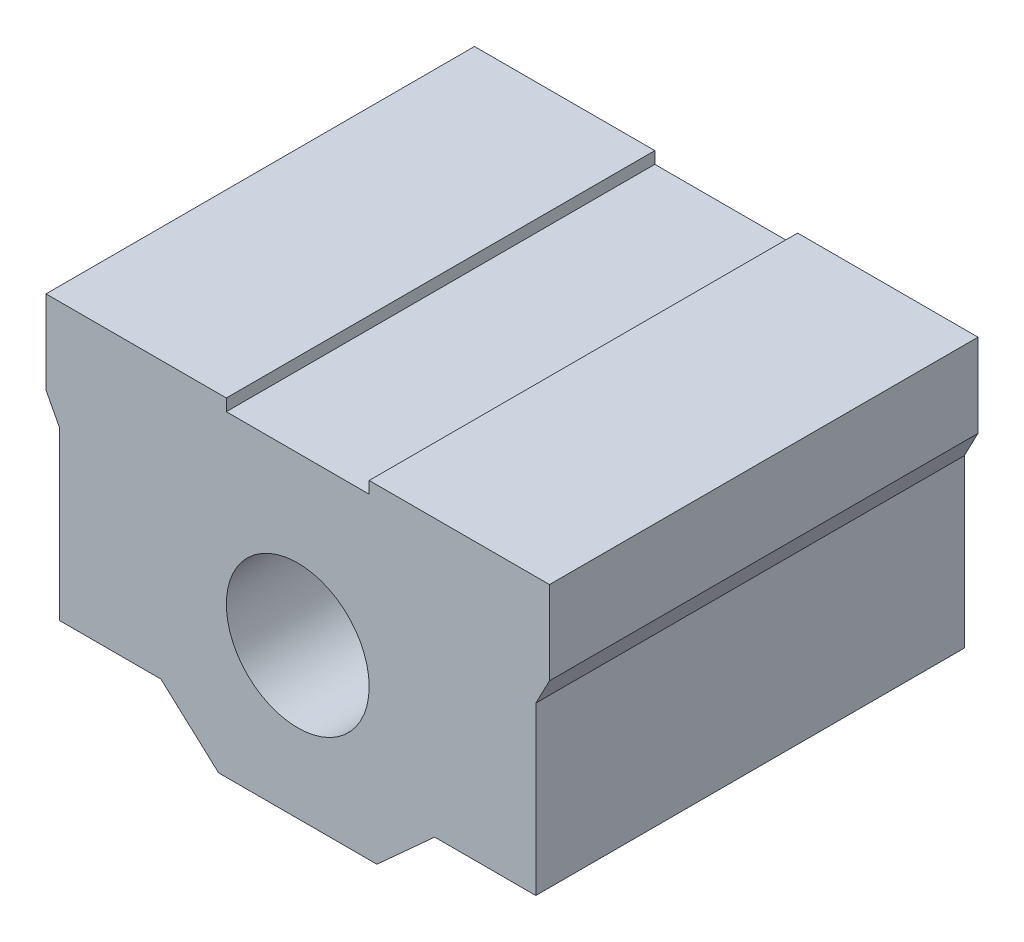
ISO-10303-21;
HEADER;
FILE_DESCRIPTION(('STEP AP214'),'2;1');
FILE_NAME('part.step','',(''),(''),'','','');
FILE_SCHEMA(('AUTOMOTIVE_DESIGN { 1 0 10303 214 1 1 1 1 }'));
ENDSEC;
DATA;
#1=APPLICATION_CONTEXT('core data for automotive mechanical design processes');
#2=APPLICATION_PROTOCOL_DEFINITION('international standard','automotive_design',2000,#1);
#3=PRODUCT_CONTEXT('',#1,'mechanical');
#4=PRODUCT('Part','Part','',(#3));
#5=PRODUCT_RELATED_PRODUCT_CATEGORY('part','',(#4));
#6=PRODUCT_DEFINITION_FORMATION('','',#4);
#7=PRODUCT_DEFINITION_CONTEXT('part definition',#1,'design');
#8=PRODUCT_DEFINITION('design','',#6,#7);
#9=PRODUCT_DEFINITION_SHAPE('','',#8);
#10=(LENGTH_UNIT() NAMED_UNIT(*) SI_UNIT(.MILLI.,.METRE.));
#11=(NAMED_UNIT(*) PLANE_ANGLE_UNIT() SI_UNIT($,.RADIAN.));
#12=(NAMED_UNIT(*) SI_UNIT($,.STERADIAN.) SOLID_ANGLE_UNIT());
#13=UNCERTAINTY_MEASURE_WITH_UNIT(LENGTH_MEASURE(1.E-05),#10,'distance_accuracy_value','');
#14=(GEOMETRIC_REPRESENTATION_CONTEXT(3) GLOBAL_UNCERTAINTY_ASSIGNED_CONTEXT((#13)) GLOBAL_UNIT_ASSIGNED_CONTEXT((#10,
#11,#12)) REPRESENTATION_CONTEXT('',''));
#15=CARTESIAN_POINT('',(0.,0.,0.));
#16=DIRECTION('',(0.,0.,1.));
#17=DIRECTION('',(1.,0.,0.));
#18=AXIS2_PLACEMENT_3D('',#15,#16,#17);
#19=CARTESIAN_POINT('',(0.,0.,36.));
#20=DIRECTION('',(0.,0.,-1.));
#21=DIRECTION('',(-1.,0.,0.));
#22=AXIS2_PLACEMENT_3D('',#19,#20,#21);
#23=PLANE('',#22);
#24=DIRECTION('',(0.740630666511788,-0.671912357247808,0.));
#25=VECTOR('',#24,1.);
#26=CARTESIAN_POINT('',(-6.65,0.,36.));
#27=LINE('',#26,#25);
#28=CARTESIAN_POINT('',(-11.5,4.4,36.));
#29=VERTEX_POINT('',#28);
#30=CARTESIAN_POINT('',(-6.65,0.,36.));
#31=VERTEX_POINT('',#30);
#32=EDGE_CURVE('E236',#29,#31,#27,.T.);
#33=ORIENTED_EDGE('',*,*,#32,.T.);
#34=DIRECTION('',(1.,0.,0.));
#35=VECTOR('',#34,1.);
#36=CARTESIAN_POINT('',(6.65000000000001,0.,36.));
#37=LINE('',#36,#35);
#38=CARTESIAN_POINT('',(6.65000000000001,0.,36.));
#39=VERTEX_POINT('',#38);
#40=EDGE_CURVE('E124',#31,#39,#37,.T.);
#41=ORIENTED_EDGE('',*,*,#40,.T.);
#42=DIRECTION('',(0.740630666511788,0.671912357247808,0.));
#43=VECTOR('',#42,1.);
#44=CARTESIAN_POINT('',(6.65000000000001,0.,36.));
#45=LINE('',#44,#43);
#46=CARTESIAN_POINT('',(11.5,4.4,36.));
#47=VERTEX_POINT('',#46);
#48=EDGE_CURVE('E289',#39,#47,#45,.T.);
#49=ORIENTED_EDGE('',*,*,#48,.T.);
#50=DIRECTION('',(1.,0.,0.));
#51=VECTOR('',#50,1.);
#52=CARTESIAN_POINT('',(11.5,4.4,36.));
#53=LINE('',#52,#51);
#54=CARTESIAN_POINT('',(20.,4.40000000000001,36.));
#55=VERTEX_POINT('',#54);
#56=EDGE_CURVE('E309',#47,#55,#53,.T.);
#57=ORIENTED_EDGE('',*,*,#56,.T.);
#58=DIRECTION('',(0.,1.,0.));
#59=VECTOR('',#58,1.);
#60=CARTESIAN_POINT('',(20.,4.40000000000001,36.));
#61=LINE('',#60,#59);
#62=CARTESIAN_POINT('',(20.,18.4,36.));
#63=VERTEX_POINT('',#62);
#64=EDGE_CURVE('E305',#55,#63,#61,.T.);
#65=ORIENTED_EDGE('',*,*,#64,.T.);
#66=DIRECTION('',(0.463254209343686,0.886225443961838,0.));
#67=VECTOR('',#66,1.);
#68=CARTESIAN_POINT('',(20.,18.4,36.));
#69=LINE('',#68,#67);
#70=CARTESIAN_POINT('',(21.15,20.6,36.));
#71=VERTEX_POINT('',#70);
#72=EDGE_CURVE('E308',#63,#71,#69,.T.);
#73=ORIENTED_EDGE('',*,*,#72,.T.);
#74=DIRECTION('',(0.,1.,0.));
#75=VECTOR('',#74,1.);
#76=CARTESIAN_POINT('',(21.15,20.6,36.));
#77=LINE('',#76,#75);
#78=CARTESIAN_POINT('',(21.15,27.6,36.));
#79=VERTEX_POINT('',#78);
#80=EDGE_CURVE('E313',#71,#79,#77,.T.);
#81=ORIENTED_EDGE('',*,*,#80,.T.);
#82=DIRECTION('',(-1.,0.,0.));
#83=VECTOR('',#82,1.);
#84=CARTESIAN_POINT('',(21.15,27.6,36.));
#85=LINE('',#84,#83);
#86=CARTESIAN_POINT('',(5.99999999999999,27.6,36.));
#87=VERTEX_POINT('',#86);
#88=EDGE_CURVE('E320',#79,#87,#85,.T.);
#89=ORIENTED_EDGE('',*,*,#88,.T.);
#90=DIRECTION('',(0.,-1.,0.));
#91=VECTOR('',#90,1.);
#92=CARTESIAN_POINT('',(5.99999999999999,27.6,36.));
#93=LINE('',#92,#91);
#94=CARTESIAN_POINT('',(5.99999999999999,26.6,36.));
#95=VERTEX_POINT('',#94);
#96=EDGE_CURVE('E323',#87,#95,#93,.T.);
#97=ORIENTED_EDGE('',*,*,#96,.T.);
#98=DIRECTION('',(-1.,0.,0.));
#99=VECTOR('',#98,1.);
#100=CARTESIAN_POINT('',(-6.00000000000001,26.6,36.));
#101=LINE('',#100,#99);
#102=CARTESIAN_POINT('',(-6.00000000000001,26.6,36.));
#103=VERTEX_POINT('',#102);
#104=EDGE_CURVE('E326',#95,#103,#101,.T.);
#105=ORIENTED_EDGE('',*,*,#104,.T.);
#106=DIRECTION('',(0.,1.,0.));
#107=VECTOR('',#106,1.);
#108=CARTESIAN_POINT('',(-6.00000000000001,27.6,36.));
#109=LINE('',#108,#107);
#110=CARTESIAN_POINT('',(-6.00000000000001,27.6,36.));
#111=VERTEX_POINT('',#110);
#112=EDGE_CURVE('E329',#103,#111,#109,.T.);
#113=ORIENTED_EDGE('',*,*,#112,.T.);
#114=DIRECTION('',(-1.,0.,0.));
#115=VECTOR('',#114,1.);
#116=CARTESIAN_POINT('',(-21.15,27.6,36.));
#117=LINE('',#116,#115);
#118=CARTESIAN_POINT('',(-21.15,27.6,36.));
#119=VERTEX_POINT('',#118);
#120=EDGE_CURVE('E332',#111,#119,#117,.T.);
#121=ORIENTED_EDGE('',*,*,#120,.T.);
#122=DIRECTION('',(0.,-1.,0.));
#123=VECTOR('',#122,1.);
#124=CARTESIAN_POINT('',(-21.15,20.6,36.));
#125=LINE('',#124,#123);
#126=CARTESIAN_POINT('',(-21.15,20.6,36.));
#127=VERTEX_POINT('',#126);
#128=EDGE_CURVE('E167',#119,#127,#125,.T.);
#129=ORIENTED_EDGE('',*,*,#128,.T.);
#130=DIRECTION('',(0.463254209343686,-0.886225443961838,0.));
#131=VECTOR('',#130,1.);
#132=CARTESIAN_POINT('',(-20.,18.4,36.));
#133=LINE('',#132,#131);
#134=CARTESIAN_POINT('',(-20.,18.4,36.));
#135=VERTEX_POINT('',#134);
#136=EDGE_CURVE('E161',#127,#135,#133,.T.);
#137=ORIENTED_EDGE('',*,*,#136,.T.);
#138=DIRECTION('',(0.,-1.,0.));
#139=VECTOR('',#138,1.);
#140=CARTESIAN_POINT('',(-20.,4.4,36.));
#141=LINE('',#140,#139);
#142=CARTESIAN_POINT('',(-20.,4.4,36.));
#143=VERTEX_POINT('',#142);
#144=EDGE_CURVE('E165',#135,#143,#141,.T.);
#145=ORIENTED_EDGE('',*,*,#144,.T.);
#146=DIRECTION('',(1.,0.,0.));
#147=VECTOR('',#146,1.);
#148=CARTESIAN_POINT('',(-11.5,4.4,36.));
#149=LINE('',#148,#147);
#150=EDGE_CURVE('E57',#143,#29,#149,.T.);
#151=ORIENTED_EDGE('',*,*,#150,.T.);
#152=EDGE_LOOP('',(#33,#41,#49,#57,#65,#73,#81,#89,#97,#105,#113,#121,#129,#137,#145,#151));
#153=FACE_BOUND('',#152,.T.);
#154=CARTESIAN_POINT('',(0.,12.6,36.));
#155=DIRECTION('',(0.,0.,1.));
#156=DIRECTION('',(1.,0.,0.));
#157=AXIS2_PLACEMENT_3D('',#154,#155,#156);
#158=CIRCLE('',#157,6.);
#159=CARTESIAN_POINT('',(6.,12.6,36.));
#160=VERTEX_POINT('',#159);
#161=EDGE_CURVE('E194',#160,#160,#158,.T.);
#162=ORIENTED_EDGE('',*,*,#161,.F.);
#163=EDGE_LOOP('',(#162));
#164=FACE_BOUND('',#163,.T.);
#165=ADVANCED_FACE('F39',(#153,#164),#23,.F.);
#166=CARTESIAN_POINT('',(0.,0.,0.));
#167=DIRECTION('',(0.,0.,-1.));
#168=DIRECTION('',(-1.,0.,0.));
#169=AXIS2_PLACEMENT_3D('',#166,#167,#168);
#170=PLANE('',#169);
#171=DIRECTION('',(0.740630666511788,-0.671912357247808,0.));
#172=VECTOR('',#171,1.);
#173=CARTESIAN_POINT('',(-6.65,0.,0.));
#174=LINE('',#173,#172);
#175=CARTESIAN_POINT('',(-11.5,4.4,0.));
#176=VERTEX_POINT('',#175);
#177=CARTESIAN_POINT('',(-6.65,0.,0.));
#178=VERTEX_POINT('',#177);
#179=EDGE_CURVE('E189',#176,#178,#174,.T.);
#180=ORIENTED_EDGE('',*,*,#179,.F.);
#181=DIRECTION('',(1.,0.,0.));
#182=VECTOR('',#181,1.);
#183=CARTESIAN_POINT('',(-11.5,4.4,0.));
#184=LINE('',#183,#182);
#185=CARTESIAN_POINT('',(-20.,4.4,0.));
#186=VERTEX_POINT('',#185);
#187=EDGE_CURVE('E116',#186,#176,#184,.T.);
#188=ORIENTED_EDGE('',*,*,#187,.F.);
#189=DIRECTION('',(0.,-1.,0.));
#190=VECTOR('',#189,1.);
#191=CARTESIAN_POINT('',(-20.,4.4,0.));
#192=LINE('',#191,#190);
#193=CARTESIAN_POINT('',(-20.,18.4,0.));
#194=VERTEX_POINT('',#193);
#195=EDGE_CURVE('E110',#194,#186,#192,.T.);
#196=ORIENTED_EDGE('',*,*,#195,.F.);
#197=DIRECTION('',(0.463254209343686,-0.886225443961838,0.));
#198=VECTOR('',#197,1.);
#199=CARTESIAN_POINT('',(-20.,18.4,0.));
#200=LINE('',#199,#198);
#201=CARTESIAN_POINT('',(-21.15,20.6,0.));
#202=VERTEX_POINT('',#201);
#203=EDGE_CURVE('E176',#202,#194,#200,.T.);
#204=ORIENTED_EDGE('',*,*,#203,.F.);
#205=DIRECTION('',(0.,-1.,0.));
#206=VECTOR('',#205,1.);
#207=CARTESIAN_POINT('',(-21.15,20.6,0.));
#208=LINE('',#207,#206);
#209=CARTESIAN_POINT('',(-21.15,27.6,0.));
#210=VERTEX_POINT('',#209);
#211=EDGE_CURVE('E227',#210,#202,#208,.T.);
#212=ORIENTED_EDGE('',*,*,#211,.F.);
#213=DIRECTION('',(-1.,0.,0.));
#214=VECTOR('',#213,1.);
#215=CARTESIAN_POINT('',(-21.15,27.6,0.));
#216=LINE('',#215,#214);
#217=CARTESIAN_POINT('',(-6.00000000000001,27.6,0.));
#218=VERTEX_POINT('',#217);
#219=EDGE_CURVE('E224',#218,#210,#216,.T.);
#220=ORIENTED_EDGE('',*,*,#219,.F.);
#221=DIRECTION('',(0.,1.,0.));
#222=VECTOR('',#221,1.);
#223=CARTESIAN_POINT('',(-6.00000000000001,27.6,0.));
#224=LINE('',#223,#222);
#225=CARTESIAN_POINT('',(-6.00000000000001,26.6,0.));
#226=VERTEX_POINT('',#225);
#227=EDGE_CURVE('E221',#226,#218,#224,.T.);
#228=ORIENTED_EDGE('',*,*,#227,.F.);
#229=DIRECTION('',(-1.,0.,0.));
#230=VECTOR('',#229,1.);
#231=CARTESIAN_POINT('',(-6.00000000000001,26.6,0.));
#232=LINE('',#231,#230);
#233=CARTESIAN_POINT('',(5.99999999999999,26.6,0.));
#234=VERTEX_POINT('',#233);
#235=EDGE_CURVE('E218',#234,#226,#232,.T.);
#236=ORIENTED_EDGE('',*,*,#235,.F.);
#237=DIRECTION('',(0.,-1.,0.));
#238=VECTOR('',#237,1.);
#239=CARTESIAN_POINT('',(5.99999999999999,27.6,0.));
#240=LINE('',#239,#238);
#241=CARTESIAN_POINT('',(5.99999999999999,27.6,0.));
#242=VERTEX_POINT('',#241);
#243=EDGE_CURVE('E215',#242,#234,#240,.T.);
#244=ORIENTED_EDGE('',*,*,#243,.F.);
#245=DIRECTION('',(-1.,0.,0.));
#246=VECTOR('',#245,1.);
#247=CARTESIAN_POINT('',(21.15,27.6,0.));
#248=LINE('',#247,#246);
#249=CARTESIAN_POINT('',(21.15,27.6,0.));
#250=VERTEX_POINT('',#249);
#251=EDGE_CURVE('E212',#250,#242,#248,.T.);
#252=ORIENTED_EDGE('',*,*,#251,.F.);
#253=DIRECTION('',(0.,1.,0.));
#254=VECTOR('',#253,1.);
#255=CARTESIAN_POINT('',(21.15,20.6,0.));
#256=LINE('',#255,#254);
#257=CARTESIAN_POINT('',(21.15,20.6,0.));
#258=VERTEX_POINT('',#257);
#259=EDGE_CURVE('E209',#258,#250,#256,.T.);
#260=ORIENTED_EDGE('',*,*,#259,.F.);
#261=DIRECTION('',(0.463254209343686,0.886225443961838,0.));
#262=VECTOR('',#261,1.);
#263=CARTESIAN_POINT('',(20.,18.4,0.));
#264=LINE('',#263,#262);
#265=CARTESIAN_POINT('',(20.,18.4,0.));
#266=VERTEX_POINT('',#265);
#267=EDGE_CURVE('E206',#266,#258,#264,.T.);
#268=ORIENTED_EDGE('',*,*,#267,.F.);
#269=DIRECTION('',(0.,1.,0.));
#270=VECTOR('',#269,1.);
#271=CARTESIAN_POINT('',(20.,4.40000000000001,0.));
#272=LINE('',#271,#270);
#273=CARTESIAN_POINT('',(20.,4.40000000000001,0.));
#274=VERTEX_POINT('',#273);
#275=EDGE_CURVE('E203',#274,#266,#272,.T.);
#276=ORIENTED_EDGE('',*,*,#275,.F.);
#277=DIRECTION('',(1.,0.,0.));
#278=VECTOR('',#277,1.);
#279=CARTESIAN_POINT('',(11.5,4.4,0.));
#280=LINE('',#279,#278);
#281=CARTESIAN_POINT('',(11.5,4.4,0.));
#282=VERTEX_POINT('',#281);
#283=EDGE_CURVE('E200',#282,#274,#280,.T.);
#284=ORIENTED_EDGE('',*,*,#283,.F.);
#285=DIRECTION('',(0.740630666511788,0.671912357247808,0.));
#286=VECTOR('',#285,1.);
#287=CARTESIAN_POINT('',(6.65000000000001,0.,0.));
#288=LINE('',#287,#286);
#289=CARTESIAN_POINT('',(6.65000000000001,0.,0.));
#290=VERTEX_POINT('',#289);
#291=EDGE_CURVE('E197',#290,#282,#288,.T.);
#292=ORIENTED_EDGE('',*,*,#291,.F.);
#293=DIRECTION('',(1.,0.,0.));
#294=VECTOR('',#293,1.);
#295=CARTESIAN_POINT('',(6.65000000000001,0.,0.));
#296=LINE('',#295,#294);
#297=EDGE_CURVE('E193',#178,#290,#296,.T.);
#298=ORIENTED_EDGE('',*,*,#297,.F.);
#299=EDGE_LOOP('',(#180,#188,#196,#204,#212,#220,#228,#236,#244,#252,#260,#268,#276,#284,#292,#298));
#300=FACE_BOUND('',#299,.T.);
#301=CARTESIAN_POINT('',(0.,12.6,0.));
#302=DIRECTION('',(0.,0.,1.));
#303=DIRECTION('',(1.,0.,0.));
#304=AXIS2_PLACEMENT_3D('',#301,#302,#303);
#305=CIRCLE('',#304,6.);
#306=CARTESIAN_POINT('',(6.,12.6,0.));
#307=VERTEX_POINT('',#306);
#308=EDGE_CURVE('E533',#307,#307,#305,.T.);
#309=ORIENTED_EDGE('',*,*,#308,.T.);
#310=EDGE_LOOP('',(#309));
#311=FACE_BOUND('',#310,.T.);
#312=ADVANCED_FACE('F293',(#300,#311),#170,.T.);
#313=CARTESIAN_POINT('',(-6.65,0.,36.));
#314=DIRECTION('',(0.671912357247808,0.740630666511788,0.));
#315=DIRECTION('',(-0.740630666511788,0.671912357247808,0.));
#316=AXIS2_PLACEMENT_3D('',#313,#314,#315);
#317=PLANE('',#316);
#318=ORIENTED_EDGE('',*,*,#179,.T.);
#319=DIRECTION('',(0.,0.,-1.));
#320=VECTOR('',#319,1.);
#321=CARTESIAN_POINT('',(-6.65,0.,36.));
#322=LINE('',#321,#320);
#323=EDGE_CURVE('E11',#31,#178,#322,.T.);
#324=ORIENTED_EDGE('',*,*,#323,.F.);
#325=ORIENTED_EDGE('',*,*,#32,.F.);
#326=DIRECTION('',(0.,0.,-1.));
#327=VECTOR('',#326,1.);
#328=CARTESIAN_POINT('',(-11.5,4.4,36.));
#329=LINE('',#328,#327);
#330=EDGE_CURVE('E185',#29,#176,#329,.T.);
#331=ORIENTED_EDGE('',*,*,#330,.T.);
#332=EDGE_LOOP('',(#318,#324,#325,#331));
#333=FACE_BOUND('',#332,.T.);
#334=ADVANCED_FACE('F41',(#333),#317,.F.);
#335=CARTESIAN_POINT('',(6.65000000000001,0.,36.));
#336=DIRECTION('',(0.,1.,0.));
#337=DIRECTION('',(-1.,0.,0.));
#338=AXIS2_PLACEMENT_3D('',#335,#336,#337);
#339=PLANE('',#338);
#340=ORIENTED_EDGE('',*,*,#297,.T.);
#341=DIRECTION('',(0.,0.,-1.));
#342=VECTOR('',#341,1.);
#343=CARTESIAN_POINT('',(6.65000000000001,0.,36.));
#344=LINE('',#343,#342);
#345=EDGE_CURVE('E49',#39,#290,#344,.T.);
#346=ORIENTED_EDGE('',*,*,#345,.F.);
#347=ORIENTED_EDGE('',*,*,#40,.F.);
#348=ORIENTED_EDGE('',*,*,#323,.T.);
#349=EDGE_LOOP('',(#340,#346,#347,#348));
#350=FACE_BOUND('',#349,.T.);
#351=ADVANCED_FACE('F368',(#350),#339,.F.);
#352=CARTESIAN_POINT('',(6.65000000000001,0.,36.));
#353=DIRECTION('',(-0.671912357247808,0.740630666511788,0.));
#354=DIRECTION('',(-0.740630666511788,-0.671912357247808,0.));
#355=AXIS2_PLACEMENT_3D('',#352,#353,#354);
#356=PLANE('',#355);
#357=ORIENTED_EDGE('',*,*,#291,.T.);
#358=DIRECTION('',(0.,0.,-1.));
#359=VECTOR('',#358,1.);
#360=CARTESIAN_POINT('',(11.5,4.4,36.));
#361=LINE('',#360,#359);
#362=EDGE_CURVE('E279',#47,#282,#361,.T.);
#363=ORIENTED_EDGE('',*,*,#362,.F.);
#364=ORIENTED_EDGE('',*,*,#48,.F.);
#365=ORIENTED_EDGE('',*,*,#345,.T.);
#366=EDGE_LOOP('',(#357,#363,#364,#365));
#367=FACE_BOUND('',#366,.T.);
#368=ADVANCED_FACE('F287',(#367),#356,.F.);
#369=CARTESIAN_POINT('',(11.5,4.4,36.));
#370=DIRECTION('',(0.,1.,0.));
#371=DIRECTION('',(-1.,0.,0.));
#372=AXIS2_PLACEMENT_3D('',#369,#370,#371);
#373=PLANE('',#372);
#374=ORIENTED_EDGE('',*,*,#283,.T.);
#375=DIRECTION('',(0.,0.,-1.));
#376=VECTOR('',#375,1.);
#377=CARTESIAN_POINT('',(20.,4.40000000000001,36.));
#378=LINE('',#377,#376);
#379=EDGE_CURVE('E275',#55,#274,#378,.T.);
#380=ORIENTED_EDGE('',*,*,#379,.F.);
#381=ORIENTED_EDGE('',*,*,#56,.F.);
#382=ORIENTED_EDGE('',*,*,#362,.T.);
#383=EDGE_LOOP('',(#374,#380,#381,#382));
#384=FACE_BOUND('',#383,.T.);
#385=ADVANCED_FACE('F299',(#384),#373,.F.);
#386=CARTESIAN_POINT('',(20.,4.40000000000001,36.));
#387=DIRECTION('',(-1.,0.,0.));
#388=DIRECTION('',(0.,-1.,0.));
#389=AXIS2_PLACEMENT_3D('',#386,#387,#388);
#390=PLANE('',#389);
#391=ORIENTED_EDGE('',*,*,#275,.T.);
#392=DIRECTION('',(0.,0.,-1.));
#393=VECTOR('',#392,1.);
#394=CARTESIAN_POINT('',(20.,18.4,36.));
#395=LINE('',#394,#393);
#396=EDGE_CURVE('E271',#63,#266,#395,.T.);
#397=ORIENTED_EDGE('',*,*,#396,.F.);
#398=ORIENTED_EDGE('',*,*,#64,.F.);
#399=ORIENTED_EDGE('',*,*,#379,.T.);
#400=EDGE_LOOP('',(#391,#397,#398,#399));
#401=FACE_BOUND('',#400,.T.);
#402=ADVANCED_FACE('F303',(#401),#390,.F.);
#403=CARTESIAN_POINT('',(20.,18.4,36.));
#404=DIRECTION('',(-0.886225443961838,0.463254209343685,0.));
#405=DIRECTION('',(-0.463254209343686,-0.886225443961838,0.));
#406=AXIS2_PLACEMENT_3D('',#403,#404,#405);
#407=PLANE('',#406);
#408=ORIENTED_EDGE('',*,*,#267,.T.);
#409=DIRECTION('',(0.,0.,-1.));
#410=VECTOR('',#409,1.);
#411=CARTESIAN_POINT('',(21.15,20.6,36.));
#412=LINE('',#411,#410);
#413=EDGE_CURVE('E267',#71,#258,#412,.T.);
#414=ORIENTED_EDGE('',*,*,#413,.F.);
#415=ORIENTED_EDGE('',*,*,#72,.F.);
#416=ORIENTED_EDGE('',*,*,#396,.T.);
#417=EDGE_LOOP('',(#408,#414,#415,#416));
#418=FACE_BOUND('',#417,.T.);
#419=ADVANCED_FACE('F381',(#418),#407,.F.);
#420=CARTESIAN_POINT('',(21.15,20.6,36.));
#421=DIRECTION('',(-1.,0.,0.));
#422=DIRECTION('',(0.,-1.,0.));
#423=AXIS2_PLACEMENT_3D('',#420,#421,#422);
#424=PLANE('',#423);
#425=ORIENTED_EDGE('',*,*,#259,.T.);
#426=DIRECTION('',(0.,0.,-1.));
#427=VECTOR('',#426,1.);
#428=CARTESIAN_POINT('',(21.15,27.6,36.));
#429=LINE('',#428,#427);
#430=EDGE_CURVE('E263',#79,#250,#429,.T.);
#431=ORIENTED_EDGE('',*,*,#430,.F.);
#432=ORIENTED_EDGE('',*,*,#80,.F.);
#433=ORIENTED_EDGE('',*,*,#413,.T.);
#434=EDGE_LOOP('',(#425,#431,#432,#433));
#435=FACE_BOUND('',#434,.T.);
#436=ADVANCED_FACE('F384',(#435),#424,.F.);
#437=CARTESIAN_POINT('',(21.15,27.6,36.));
#438=DIRECTION('',(0.,-1.,0.));
#439=DIRECTION('',(1.,0.,0.));
#440=AXIS2_PLACEMENT_3D('',#437,#438,#439);
#441=PLANE('',#440);
#442=ORIENTED_EDGE('',*,*,#251,.T.);
#443=DIRECTION('',(0.,0.,-1.));
#444=VECTOR('',#443,1.);
#445=CARTESIAN_POINT('',(5.99999999999999,27.6,36.));
#446=LINE('',#445,#444);
#447=EDGE_CURVE('E259',#87,#242,#446,.T.);
#448=ORIENTED_EDGE('',*,*,#447,.F.);
#449=ORIENTED_EDGE('',*,*,#88,.F.);
#450=ORIENTED_EDGE('',*,*,#430,.T.);
#451=EDGE_LOOP('',(#442,#448,#449,#450));
#452=FACE_BOUND('',#451,.T.);
#453=ADVANCED_FACE('F388',(#452),#441,.F.);
#454=CARTESIAN_POINT('',(5.99999999999999,27.6,36.));
#455=DIRECTION('',(1.,0.,0.));
#456=DIRECTION('',(0.,0.,-1.));
#457=AXIS2_PLACEMENT_3D('',#454,#455,#456);
#458=PLANE('',#457);
#459=ORIENTED_EDGE('',*,*,#243,.T.);
#460=DIRECTION('',(0.,0.,-1.));
#461=VECTOR('',#460,1.);
#462=CARTESIAN_POINT('',(5.99999999999999,26.6,36.));
#463=LINE('',#462,#461);
#464=EDGE_CURVE('E255',#95,#234,#463,.T.);
#465=ORIENTED_EDGE('',*,*,#464,.F.);
#466=ORIENTED_EDGE('',*,*,#96,.F.);
#467=ORIENTED_EDGE('',*,*,#447,.T.);
#468=EDGE_LOOP('',(#459,#465,#466,#467));
#469=FACE_BOUND('',#468,.T.);
#470=ADVANCED_FACE('F392',(#469),#458,.F.);
#471=CARTESIAN_POINT('',(-6.00000000000001,26.6,36.));
#472=DIRECTION('',(0.,-1.,0.));
#473=DIRECTION('',(1.,0.,0.));
#474=AXIS2_PLACEMENT_3D('',#471,#472,#473);
#475=PLANE('',#474);
#476=ORIENTED_EDGE('',*,*,#235,.T.);
#477=DIRECTION('',(0.,0.,-1.));
#478=VECTOR('',#477,1.);
#479=CARTESIAN_POINT('',(-6.00000000000001,26.6,36.));
#480=LINE('',#479,#478);
#481=EDGE_CURVE('E251',#103,#226,#480,.T.);
#482=ORIENTED_EDGE('',*,*,#481,.F.);
#483=ORIENTED_EDGE('',*,*,#104,.F.);
#484=ORIENTED_EDGE('',*,*,#464,.T.);
#485=EDGE_LOOP('',(#476,#482,#483,#484));
#486=FACE_BOUND('',#485,.T.);
#487=ADVANCED_FACE('F396',(#486),#475,.F.);
#488=CARTESIAN_POINT('',(-6.00000000000001,27.6,36.));
#489=DIRECTION('',(-1.,0.,0.));
#490=DIRECTION('',(0.,0.,1.));
#491=AXIS2_PLACEMENT_3D('',#488,#489,#490);
#492=PLANE('',#491);
#493=ORIENTED_EDGE('',*,*,#227,.T.);
#494=DIRECTION('',(0.,0.,-1.));
#495=VECTOR('',#494,1.);
#496=CARTESIAN_POINT('',(-6.00000000000001,27.6,36.));
#497=LINE('',#496,#495);
#498=EDGE_CURVE('E247',#111,#218,#497,.T.);
#499=ORIENTED_EDGE('',*,*,#498,.F.);
#500=ORIENTED_EDGE('',*,*,#112,.F.);
#501=ORIENTED_EDGE('',*,*,#481,.T.);
#502=EDGE_LOOP('',(#493,#499,#500,#501));
#503=FACE_BOUND('',#502,.T.);
#504=ADVANCED_FACE('F400',(#503),#492,.F.);
#505=CARTESIAN_POINT('',(-21.15,27.6,36.));
#506=DIRECTION('',(0.,-1.,0.));
#507=DIRECTION('',(1.,0.,0.));
#508=AXIS2_PLACEMENT_3D('',#505,#506,#507);
#509=PLANE('',#508);
#510=ORIENTED_EDGE('',*,*,#219,.T.);
#511=DIRECTION('',(0.,0.,-1.));
#512=VECTOR('',#511,1.);
#513=CARTESIAN_POINT('',(-21.15,27.6,36.));
#514=LINE('',#513,#512);
#515=EDGE_CURVE('E243',#119,#210,#514,.T.);
#516=ORIENTED_EDGE('',*,*,#515,.F.);
#517=ORIENTED_EDGE('',*,*,#120,.F.);
#518=ORIENTED_EDGE('',*,*,#498,.T.);
#519=EDGE_LOOP('',(#510,#516,#517,#518));
#520=FACE_BOUND('',#519,.T.);
#521=ADVANCED_FACE('F340',(#520),#509,.F.);
#522=CARTESIAN_POINT('',(-21.15,20.6,36.));
#523=DIRECTION('',(1.,0.,0.));
#524=DIRECTION('',(0.,1.,0.));
#525=AXIS2_PLACEMENT_3D('',#522,#523,#524);
#526=PLANE('',#525);
#527=ORIENTED_EDGE('',*,*,#211,.T.);
#528=DIRECTION('',(0.,0.,-1.));
#529=VECTOR('',#528,1.);
#530=CARTESIAN_POINT('',(-21.15,20.6,36.));
#531=LINE('',#530,#529);
#532=EDGE_CURVE('E178',#127,#202,#531,.T.);
#533=ORIENTED_EDGE('',*,*,#532,.F.);
#534=ORIENTED_EDGE('',*,*,#128,.F.);
#535=ORIENTED_EDGE('',*,*,#515,.T.);
#536=EDGE_LOOP('',(#527,#533,#534,#535));
#537=FACE_BOUND('',#536,.T.);
#538=ADVANCED_FACE('F344',(#537),#526,.F.);
#539=CARTESIAN_POINT('',(-20.,18.4,36.));
#540=DIRECTION('',(0.886225443961838,0.463254209343685,0.));
#541=DIRECTION('',(-0.463254209343686,0.886225443961838,0.));
#542=AXIS2_PLACEMENT_3D('',#539,#540,#541);
#543=PLANE('',#542);
#544=ORIENTED_EDGE('',*,*,#203,.T.);
#545=DIRECTION('',(0.,0.,-1.));
#546=VECTOR('',#545,1.);
#547=CARTESIAN_POINT('',(-20.,18.4,36.));
#548=LINE('',#547,#546);
#549=EDGE_CURVE('E173',#135,#194,#548,.T.);
#550=ORIENTED_EDGE('',*,*,#549,.F.);
#551=ORIENTED_EDGE('',*,*,#136,.F.);
#552=ORIENTED_EDGE('',*,*,#532,.T.);
#553=EDGE_LOOP('',(#544,#550,#551,#552));
#554=FACE_BOUND('',#553,.T.);
#555=ADVANCED_FACE('F174',(#554),#543,.F.);
#556=CARTESIAN_POINT('',(-20.,4.4,36.));
#557=DIRECTION('',(1.,0.,0.));
#558=DIRECTION('',(0.,1.,0.));
#559=AXIS2_PLACEMENT_3D('',#556,#557,#558);
#560=PLANE('',#559);
#561=ORIENTED_EDGE('',*,*,#195,.T.);
#562=DIRECTION('',(0.,0.,-1.));
#563=VECTOR('',#562,1.);
#564=CARTESIAN_POINT('',(-20.,4.4,36.));
#565=LINE('',#564,#563);
#566=EDGE_CURVE('E179',#143,#186,#565,.T.);
#567=ORIENTED_EDGE('',*,*,#566,.F.);
#568=ORIENTED_EDGE('',*,*,#144,.F.);
#569=ORIENTED_EDGE('',*,*,#549,.T.);
#570=EDGE_LOOP('',(#561,#567,#568,#569));
#571=FACE_BOUND('',#570,.T.);
#572=ADVANCED_FACE('F181',(#571),#560,.F.);
#573=CARTESIAN_POINT('',(-11.5,4.4,36.));
#574=DIRECTION('',(0.,1.,0.));
#575=DIRECTION('',(-1.,0.,0.));
#576=AXIS2_PLACEMENT_3D('',#573,#574,#575);
#577=PLANE('',#576);
#578=ORIENTED_EDGE('',*,*,#187,.T.);
#579=ORIENTED_EDGE('',*,*,#330,.F.);
#580=ORIENTED_EDGE('',*,*,#150,.F.);
#581=ORIENTED_EDGE('',*,*,#566,.T.);
#582=EDGE_LOOP('',(#578,#579,#580,#581));
#583=FACE_BOUND('',#582,.T.);
#584=ADVANCED_FACE('F348',(#583),#577,.F.);
#585=CARTESIAN_POINT('',(0.,12.6,36.));
#586=DIRECTION('',(0.,0.,-1.));
#587=DIRECTION('',(-1.,0.,0.));
#588=AXIS2_PLACEMENT_3D('',#585,#586,#587);
#589=CYLINDRICAL_SURFACE('',#588,6.);
#590=ORIENTED_EDGE('',*,*,#161,.T.);
#591=EDGE_LOOP('',(#590));
#592=FACE_BOUND('',#591,.T.);
#593=ORIENTED_EDGE('',*,*,#308,.F.);
#594=EDGE_LOOP('',(#593));
#595=FACE_BOUND('',#594,.T.);
#596=ADVANCED_FACE('F350',(#592,#595),#589,.F.);
#597=CLOSED_SHELL('',(#165,#312,#334,#351,#368,#385,#402,#419,#436,#453,#470,#487,#504,#521,
#538,#555,#572,#584,#596));
#598=MANIFOLD_SOLID_BREP('B2',#597);
#599=ADVANCED_BREP_SHAPE_REPRESENTATION('',(#18,#598),#14);
#600=SHAPE_DEFINITION_REPRESENTATION(#9,#599);
ENDSEC;
END-ISO-10303-21;
